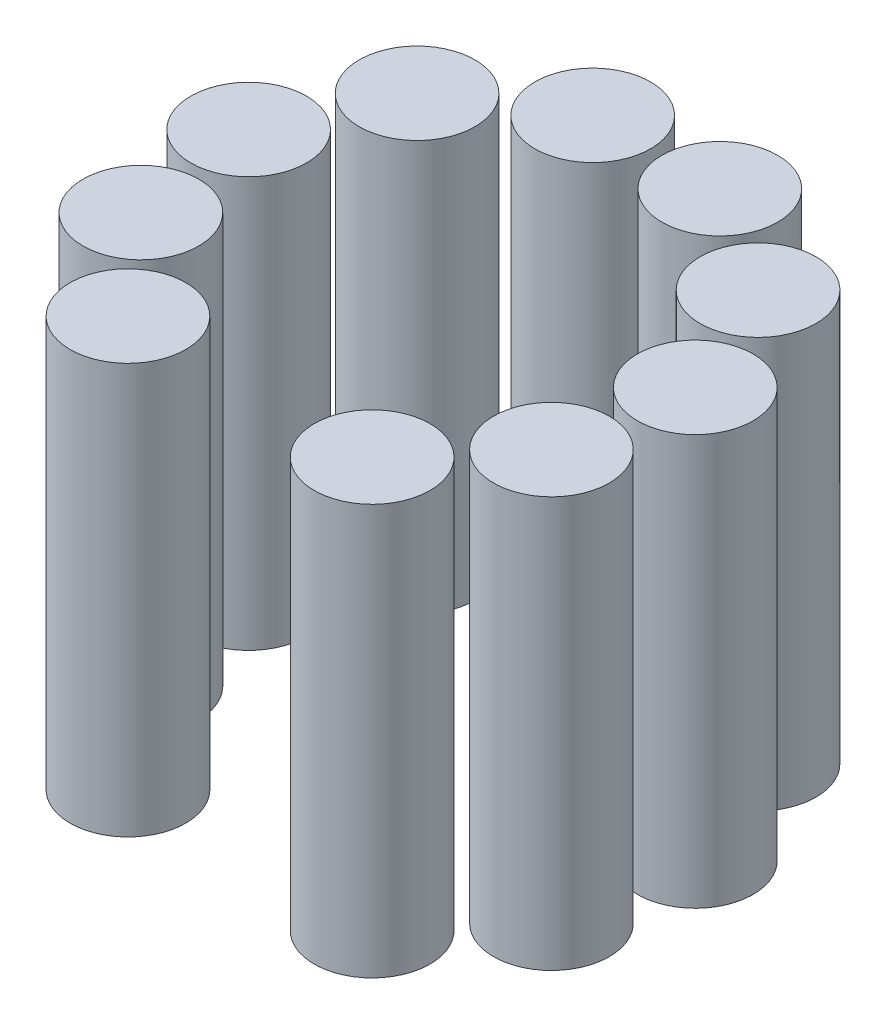
ISO-10303-21;
HEADER;
FILE_DESCRIPTION(('STEP AP214'),'2;1');
FILE_NAME('part.step','',(''),(''),'','','');
FILE_SCHEMA(('AUTOMOTIVE_DESIGN { 1 0 10303 214 1 1 1 1 }'));
ENDSEC;
DATA;
#1=APPLICATION_CONTEXT('core data for automotive mechanical design processes');
#2=APPLICATION_PROTOCOL_DEFINITION('international standard','automotive_design',2000,#1);
#3=PRODUCT_CONTEXT('',#1,'mechanical');
#4=PRODUCT('Part','Part','',(#3));
#5=PRODUCT_RELATED_PRODUCT_CATEGORY('part','',(#4));
#6=PRODUCT_DEFINITION_FORMATION('','',#4);
#7=PRODUCT_DEFINITION_CONTEXT('part definition',#1,'design');
#8=PRODUCT_DEFINITION('design','',#6,#7);
#9=PRODUCT_DEFINITION_SHAPE('','',#8);
#10=(LENGTH_UNIT() NAMED_UNIT(*) SI_UNIT(.MILLI.,.METRE.));
#11=(NAMED_UNIT(*) PLANE_ANGLE_UNIT() SI_UNIT($,.RADIAN.));
#12=(NAMED_UNIT(*) SI_UNIT($,.STERADIAN.) SOLID_ANGLE_UNIT());
#13=UNCERTAINTY_MEASURE_WITH_UNIT(LENGTH_MEASURE(1.E-05),#10,'distance_accuracy_value','');
#14=(GEOMETRIC_REPRESENTATION_CONTEXT(3) GLOBAL_UNCERTAINTY_ASSIGNED_CONTEXT((#13)) GLOBAL_UNIT_ASSIGNED_CONTEXT((#10,
#11,#12)) REPRESENTATION_CONTEXT('',''));
#15=CARTESIAN_POINT('',(0.,0.,0.));
#16=DIRECTION('',(0.,0.,1.));
#17=DIRECTION('',(1.,0.,0.));
#18=AXIS2_PLACEMENT_3D('',#15,#16,#17);
#19=CARTESIAN_POINT('',(10.0697618662976,65.,-34.3025129685284));
#20=DIRECTION('',(0.,-1.,0.));
#21=DIRECTION('',(0.,0.,-1.));
#22=AXIS2_PLACEMENT_3D('',#19,#20,#21);
#23=CYLINDRICAL_SURFACE('',#22,9.175);
#24=CARTESIAN_POINT('',(10.0697618662976,65.,-34.3025129685284));
#25=DIRECTION('',(0.,1.,0.));
#26=DIRECTION('',(0.,0.,-1.));
#27=AXIS2_PLACEMENT_3D('',#24,#25,#26);
#28=CIRCLE('',#27,9.175);
#29=CARTESIAN_POINT('',(10.0697618662976,65.,-43.4775129685284));
#30=VERTEX_POINT('',#29);
#31=EDGE_CURVE('E11',#30,#30,#28,.T.);
#32=ORIENTED_EDGE('',*,*,#31,.F.);
#33=EDGE_LOOP('',(#32));
#34=FACE_BOUND('',#33,.T.);
#35=CARTESIAN_POINT('',(10.0697618662976,0.,-34.3025129685284));
#36=DIRECTION('',(0.,1.,0.));
#37=DIRECTION('',(0.,0.,-1.));
#38=AXIS2_PLACEMENT_3D('',#35,#36,#37);
#39=CIRCLE('',#38,9.175);
#40=CARTESIAN_POINT('',(10.0697618662976,0.,-43.4775129685284));
#41=VERTEX_POINT('',#40);
#42=EDGE_CURVE('E48',#41,#41,#39,.T.);
#43=ORIENTED_EDGE('',*,*,#42,.T.);
#44=EDGE_LOOP('',(#43));
#45=FACE_BOUND('',#44,.T.);
#46=ADVANCED_FACE('F45',(#34,#45),#23,.T.);
#47=CARTESIAN_POINT('',(10.0697618662976,65.,-34.3025129685284));
#48=DIRECTION('',(0.,-1.,0.));
#49=DIRECTION('',(0.,0.,-1.));
#50=AXIS2_PLACEMENT_3D('',#47,#48,#49);
#51=PLANE('',#50);
#52=ORIENTED_EDGE('',*,*,#31,.T.);
#53=EDGE_LOOP('',(#52));
#54=FACE_BOUND('',#53,.T.);
#55=ADVANCED_FACE('F60',(#54),#51,.F.);
#56=CARTESIAN_POINT('',(10.0697618662976,0.,-34.3025129685284));
#57=DIRECTION('',(0.,-1.,0.));
#58=DIRECTION('',(0.,0.,-1.));
#59=AXIS2_PLACEMENT_3D('',#56,#57,#58);
#60=PLANE('',#59);
#61=ORIENTED_EDGE('',*,*,#42,.F.);
#62=EDGE_LOOP('',(#61));
#63=FACE_BOUND('',#62,.T.);
#64=ADVANCED_FACE('F58',(#63),#60,.T.);
#65=CLOSED_SHELL('',(#46,#55,#64));
#66=MANIFOLD_SOLID_BREP('B2',#65);
#67=CARTESIAN_POINT('',(27.0135892978425,65.,-23.4164150383335));
#68=DIRECTION('',(0.,-1.,0.));
#69=DIRECTION('',(0.,0.,-1.));
#70=AXIS2_PLACEMENT_3D('',#67,#68,#69);
#71=CYLINDRICAL_SURFACE('',#70,9.17500000000004);
#72=CARTESIAN_POINT('',(27.0135892978425,65.,-23.4164150383335));
#73=DIRECTION('',(0.,1.,0.));
#74=DIRECTION('',(0.,0.,-1.));
#75=AXIS2_PLACEMENT_3D('',#72,#73,#74);
#76=CIRCLE('',#75,9.17500000000004);
#77=CARTESIAN_POINT('',(27.0135892978425,65.,-32.5914150383335));
#78=VERTEX_POINT('',#77);
#79=EDGE_CURVE('E44',#78,#78,#76,.T.);
#80=ORIENTED_EDGE('',*,*,#79,.F.);
#81=EDGE_LOOP('',(#80));
#82=FACE_BOUND('',#81,.T.);
#83=CARTESIAN_POINT('',(27.0135892978425,0.,-23.4164150383335));
#84=DIRECTION('',(0.,1.,0.));
#85=DIRECTION('',(0.,0.,-1.));
#86=AXIS2_PLACEMENT_3D('',#83,#84,#85);
#87=CIRCLE('',#86,9.17500000000004);
#88=CARTESIAN_POINT('',(27.0135892978425,0.,-32.5914150383335));
#89=VERTEX_POINT('',#88);
#90=EDGE_CURVE('E102',#89,#89,#87,.T.);
#91=ORIENTED_EDGE('',*,*,#90,.T.);
#92=EDGE_LOOP('',(#91));
#93=FACE_BOUND('',#92,.T.);
#94=ADVANCED_FACE('F99',(#82,#93),#71,.T.);
#95=CARTESIAN_POINT('',(27.0135892978425,65.,-23.4164150383335));
#96=DIRECTION('',(0.,-1.,0.));
#97=DIRECTION('',(0.,0.,-1.));
#98=AXIS2_PLACEMENT_3D('',#95,#96,#97);
#99=PLANE('',#98);
#100=ORIENTED_EDGE('',*,*,#79,.T.);
#101=EDGE_LOOP('',(#100));
#102=FACE_BOUND('',#101,.T.);
#103=ADVANCED_FACE('F114',(#102),#99,.F.);
#104=CARTESIAN_POINT('',(27.0135892978425,0.,-23.4164150383335));
#105=DIRECTION('',(0.,-1.,0.));
#106=DIRECTION('',(0.,0.,-1.));
#107=AXIS2_PLACEMENT_3D('',#104,#105,#106);
#108=PLANE('',#107);
#109=ORIENTED_EDGE('',*,*,#90,.F.);
#110=EDGE_LOOP('',(#109));
#111=FACE_BOUND('',#110,.T.);
#112=ADVANCED_FACE('F112',(#111),#108,.T.);
#113=CLOSED_SHELL('',(#94,#103,#112));
#114=MANIFOLD_SOLID_BREP('B6',#113);
#115=CARTESIAN_POINT('',(35.3845002549535,65.,-5.09898437997192));
#116=DIRECTION('',(0.,-1.,0.));
#117=DIRECTION('',(0.,0.,-1.));
#118=AXIS2_PLACEMENT_3D('',#115,#116,#117);
#119=CYLINDRICAL_SURFACE('',#118,9.17500000000001);
#120=CARTESIAN_POINT('',(35.3845002549535,65.,-5.09898437997192));
#121=DIRECTION('',(0.,1.,0.));
#122=DIRECTION('',(0.,0.,-1.));
#123=AXIS2_PLACEMENT_3D('',#120,#121,#122);
#124=CIRCLE('',#123,9.17500000000001);
#125=CARTESIAN_POINT('',(35.3845002549535,65.,-14.2739843799719));
#126=VERTEX_POINT('',#125);
#127=EDGE_CURVE('E98',#126,#126,#124,.T.);
#128=ORIENTED_EDGE('',*,*,#127,.F.);
#129=EDGE_LOOP('',(#128));
#130=FACE_BOUND('',#129,.T.);
#131=CARTESIAN_POINT('',(35.3845002549535,0.,-5.09898437997192));
#132=DIRECTION('',(0.,1.,0.));
#133=DIRECTION('',(0.,0.,-1.));
#134=AXIS2_PLACEMENT_3D('',#131,#132,#133);
#135=CIRCLE('',#134,9.17500000000001);
#136=CARTESIAN_POINT('',(35.3845002549535,0.,-14.2739843799719));
#137=VERTEX_POINT('',#136);
#138=EDGE_CURVE('E156',#137,#137,#135,.T.);
#139=ORIENTED_EDGE('',*,*,#138,.T.);
#140=EDGE_LOOP('',(#139));
#141=FACE_BOUND('',#140,.T.);
#142=ADVANCED_FACE('F153',(#130,#141),#119,.T.);
#143=CARTESIAN_POINT('',(35.3845002549535,65.,-5.09898437997192));
#144=DIRECTION('',(0.,-1.,0.));
#145=DIRECTION('',(0.,0.,-1.));
#146=AXIS2_PLACEMENT_3D('',#143,#144,#145);
#147=PLANE('',#146);
#148=ORIENTED_EDGE('',*,*,#127,.T.);
#149=EDGE_LOOP('',(#148));
#150=FACE_BOUND('',#149,.T.);
#151=ADVANCED_FACE('F168',(#150),#147,.F.);
#152=CARTESIAN_POINT('',(35.3845002549535,0.,-5.09898437997192));
#153=DIRECTION('',(0.,-1.,0.));
#154=DIRECTION('',(0.,0.,-1.));
#155=AXIS2_PLACEMENT_3D('',#152,#153,#154);
#156=PLANE('',#155);
#157=ORIENTED_EDGE('',*,*,#138,.F.);
#158=EDGE_LOOP('',(#157));
#159=FACE_BOUND('',#158,.T.);
#160=ADVANCED_FACE('F166',(#159),#156,.T.);
#161=CLOSED_SHELL('',(#142,#151,#160));
#162=MANIFOLD_SOLID_BREP('B39',#161);
#163=CARTESIAN_POINT('',(32.5259384518664,65.,14.8366380229955));
#164=DIRECTION('',(0.,-1.,0.));
#165=DIRECTION('',(0.,0.,-1.));
#166=AXIS2_PLACEMENT_3D('',#163,#164,#165);
#167=CYLINDRICAL_SURFACE('',#166,9.17500000000001);
#168=CARTESIAN_POINT('',(32.5259384518664,65.,14.8366380229955));
#169=DIRECTION('',(0.,1.,0.));
#170=DIRECTION('',(0.,0.,-1.));
#171=AXIS2_PLACEMENT_3D('',#168,#169,#170);
#172=CIRCLE('',#171,9.17500000000001);
#173=CARTESIAN_POINT('',(32.5259384518664,65.,5.66163802299551));
#174=VERTEX_POINT('',#173);
#175=EDGE_CURVE('E152',#174,#174,#172,.T.);
#176=ORIENTED_EDGE('',*,*,#175,.F.);
#177=EDGE_LOOP('',(#176));
#178=FACE_BOUND('',#177,.T.);
#179=CARTESIAN_POINT('',(32.5259384518664,0.,14.8366380229955));
#180=DIRECTION('',(0.,1.,0.));
#181=DIRECTION('',(0.,0.,-1.));
#182=AXIS2_PLACEMENT_3D('',#179,#180,#181);
#183=CIRCLE('',#182,9.17500000000001);
#184=CARTESIAN_POINT('',(32.5259384518664,0.,5.66163802299551));
#185=VERTEX_POINT('',#184);
#186=EDGE_CURVE('E210',#185,#185,#183,.T.);
#187=ORIENTED_EDGE('',*,*,#186,.T.);
#188=EDGE_LOOP('',(#187));
#189=FACE_BOUND('',#188,.T.);
#190=ADVANCED_FACE('F207',(#178,#189),#167,.T.);
#191=CARTESIAN_POINT('',(32.5259384518664,65.,14.8366380229955));
#192=DIRECTION('',(0.,-1.,0.));
#193=DIRECTION('',(0.,0.,-1.));
#194=AXIS2_PLACEMENT_3D('',#191,#192,#193);
#195=PLANE('',#194);
#196=ORIENTED_EDGE('',*,*,#175,.T.);
#197=EDGE_LOOP('',(#196));
#198=FACE_BOUND('',#197,.T.);
#199=ADVANCED_FACE('F222',(#198),#195,.F.);
#200=CARTESIAN_POINT('',(32.5259384518664,0.,14.8366380229955));
#201=DIRECTION('',(0.,-1.,0.));
#202=DIRECTION('',(0.,0.,-1.));
#203=AXIS2_PLACEMENT_3D('',#200,#201,#202);
#204=PLANE('',#203);
#205=ORIENTED_EDGE('',*,*,#186,.F.);
#206=EDGE_LOOP('',(#205));
#207=FACE_BOUND('',#206,.T.);
#208=ADVANCED_FACE('F220',(#207),#204,.T.);
#209=CLOSED_SHELL('',(#190,#199,#208));
#210=MANIFOLD_SOLID_BREP('B93',#209);
#211=CARTESIAN_POINT('',(19.3450847635356,65.,30.0637688171597));
#212=DIRECTION('',(0.,-1.,0.));
#213=DIRECTION('',(0.,0.,-1.));
#214=AXIS2_PLACEMENT_3D('',#211,#212,#213);
#215=CYLINDRICAL_SURFACE('',#214,9.175);
#216=CARTESIAN_POINT('',(19.3450847635356,65.,30.0637688171597));
#217=DIRECTION('',(0.,1.,0.));
#218=DIRECTION('',(0.,0.,-1.));
#219=AXIS2_PLACEMENT_3D('',#216,#217,#218);
#220=CIRCLE('',#219,9.175);
#221=CARTESIAN_POINT('',(19.3450847635356,65.,20.8887688171597));
#222=VERTEX_POINT('',#221);
#223=EDGE_CURVE('E206',#222,#222,#220,.T.);
#224=ORIENTED_EDGE('',*,*,#223,.F.);
#225=EDGE_LOOP('',(#224));
#226=FACE_BOUND('',#225,.T.);
#227=CARTESIAN_POINT('',(19.3450847635356,0.,30.0637688171597));
#228=DIRECTION('',(0.,1.,0.));
#229=DIRECTION('',(0.,0.,-1.));
#230=AXIS2_PLACEMENT_3D('',#227,#228,#229);
#231=CIRCLE('',#230,9.175);
#232=CARTESIAN_POINT('',(19.3450847635356,0.,20.8887688171597));
#233=VERTEX_POINT('',#232);
#234=EDGE_CURVE('E264',#233,#233,#231,.T.);
#235=ORIENTED_EDGE('',*,*,#234,.T.);
#236=EDGE_LOOP('',(#235));
#237=FACE_BOUND('',#236,.T.);
#238=ADVANCED_FACE('F261',(#226,#237),#215,.T.);
#239=CARTESIAN_POINT('',(19.3450847635356,65.,30.0637688171597));
#240=DIRECTION('',(0.,-1.,0.));
#241=DIRECTION('',(0.,0.,-1.));
#242=AXIS2_PLACEMENT_3D('',#239,#240,#241);
#243=PLANE('',#242);
#244=ORIENTED_EDGE('',*,*,#223,.T.);
#245=EDGE_LOOP('',(#244));
#246=FACE_BOUND('',#245,.T.);
#247=ADVANCED_FACE('F276',(#246),#243,.F.);
#248=CARTESIAN_POINT('',(19.3450847635356,0.,30.0637688171597));
#249=DIRECTION('',(0.,-1.,0.));
#250=DIRECTION('',(0.,0.,-1.));
#251=AXIS2_PLACEMENT_3D('',#248,#249,#250);
#252=PLANE('',#251);
#253=ORIENTED_EDGE('',*,*,#234,.F.);
#254=EDGE_LOOP('',(#253));
#255=FACE_BOUND('',#254,.T.);
#256=ADVANCED_FACE('F274',(#255),#252,.T.);
#257=CLOSED_SHELL('',(#238,#247,#256));
#258=MANIFOLD_SOLID_BREP('B147',#257);
#259=CARTESIAN_POINT('',(-19.3450847635356,65.,30.0637688171597));
#260=DIRECTION('',(0.,-1.,0.));
#261=DIRECTION('',(0.,0.,-1.));
#262=AXIS2_PLACEMENT_3D('',#259,#260,#261);
#263=CYLINDRICAL_SURFACE('',#262,9.175);
#264=CARTESIAN_POINT('',(-19.3450847635356,65.,30.0637688171597));
#265=DIRECTION('',(0.,1.,0.));
#266=DIRECTION('',(0.,0.,1.));
#267=AXIS2_PLACEMENT_3D('',#264,#265,#266);
#268=CIRCLE('',#267,9.175);
#269=CARTESIAN_POINT('',(-19.3450847635356,65.,39.2387688171597));
#270=VERTEX_POINT('',#269);
#271=EDGE_CURVE('E260',#270,#270,#268,.T.);
#272=ORIENTED_EDGE('',*,*,#271,.F.);
#273=EDGE_LOOP('',(#272));
#274=FACE_BOUND('',#273,.T.);
#275=CARTESIAN_POINT('',(-19.3450847635356,0.,30.0637688171597));
#276=DIRECTION('',(0.,1.,0.));
#277=DIRECTION('',(0.,0.,1.));
#278=AXIS2_PLACEMENT_3D('',#275,#276,#277);
#279=CIRCLE('',#278,9.175);
#280=CARTESIAN_POINT('',(-19.3450847635356,0.,39.2387688171597));
#281=VERTEX_POINT('',#280);
#282=EDGE_CURVE('E318',#281,#281,#279,.T.);
#283=ORIENTED_EDGE('',*,*,#282,.T.);
#284=EDGE_LOOP('',(#283));
#285=FACE_BOUND('',#284,.T.);
#286=ADVANCED_FACE('F315',(#274,#285),#263,.T.);
#287=CARTESIAN_POINT('',(-19.3450847635356,65.,30.0637688171597));
#288=DIRECTION('',(0.,1.,0.));
#289=DIRECTION('',(0.,0.,1.));
#290=AXIS2_PLACEMENT_3D('',#287,#288,#289);
#291=PLANE('',#290);
#292=ORIENTED_EDGE('',*,*,#271,.T.);
#293=EDGE_LOOP('',(#292));
#294=FACE_BOUND('',#293,.T.);
#295=ADVANCED_FACE('F330',(#294),#291,.T.);
#296=CARTESIAN_POINT('',(-19.3450847635356,0.,30.0637688171597));
#297=DIRECTION('',(0.,1.,0.));
#298=DIRECTION('',(0.,0.,1.));
#299=AXIS2_PLACEMENT_3D('',#296,#297,#298);
#300=PLANE('',#299);
#301=ORIENTED_EDGE('',*,*,#282,.F.);
#302=EDGE_LOOP('',(#301));
#303=FACE_BOUND('',#302,.T.);
#304=ADVANCED_FACE('F328',(#303),#300,.F.);
#305=CLOSED_SHELL('',(#286,#295,#304));
#306=MANIFOLD_SOLID_BREP('B201',#305);
#307=CARTESIAN_POINT('',(-32.5259384518664,65.,14.8366380229955));
#308=DIRECTION('',(0.,-1.,0.));
#309=DIRECTION('',(0.,0.,-1.));
#310=AXIS2_PLACEMENT_3D('',#307,#308,#309);
#311=CYLINDRICAL_SURFACE('',#310,9.175);
#312=CARTESIAN_POINT('',(-32.5259384518664,65.,14.8366380229955));
#313=DIRECTION('',(0.,1.,0.));
#314=DIRECTION('',(0.,0.,1.));
#315=AXIS2_PLACEMENT_3D('',#312,#313,#314);
#316=CIRCLE('',#315,9.175);
#317=CARTESIAN_POINT('',(-32.5259384518664,65.,24.0116380229955));
#318=VERTEX_POINT('',#317);
#319=EDGE_CURVE('E314',#318,#318,#316,.T.);
#320=ORIENTED_EDGE('',*,*,#319,.F.);
#321=EDGE_LOOP('',(#320));
#322=FACE_BOUND('',#321,.T.);
#323=CARTESIAN_POINT('',(-32.5259384518664,0.,14.8366380229955));
#324=DIRECTION('',(0.,1.,0.));
#325=DIRECTION('',(0.,0.,1.));
#326=AXIS2_PLACEMENT_3D('',#323,#324,#325);
#327=CIRCLE('',#326,9.175);
#328=CARTESIAN_POINT('',(-32.5259384518664,0.,24.0116380229955));
#329=VERTEX_POINT('',#328);
#330=EDGE_CURVE('E372',#329,#329,#327,.T.);
#331=ORIENTED_EDGE('',*,*,#330,.T.);
#332=EDGE_LOOP('',(#331));
#333=FACE_BOUND('',#332,.T.);
#334=ADVANCED_FACE('F369',(#322,#333),#311,.T.);
#335=CARTESIAN_POINT('',(-32.5259384518664,65.,14.8366380229955));
#336=DIRECTION('',(0.,1.,0.));
#337=DIRECTION('',(0.,0.,1.));
#338=AXIS2_PLACEMENT_3D('',#335,#336,#337);
#339=PLANE('',#338);
#340=ORIENTED_EDGE('',*,*,#319,.T.);
#341=EDGE_LOOP('',(#340));
#342=FACE_BOUND('',#341,.T.);
#343=ADVANCED_FACE('F384',(#342),#339,.T.);
#344=CARTESIAN_POINT('',(-32.5259384518664,0.,14.8366380229955));
#345=DIRECTION('',(0.,1.,0.));
#346=DIRECTION('',(0.,0.,1.));
#347=AXIS2_PLACEMENT_3D('',#344,#345,#346);
#348=PLANE('',#347);
#349=ORIENTED_EDGE('',*,*,#330,.F.);
#350=EDGE_LOOP('',(#349));
#351=FACE_BOUND('',#350,.T.);
#352=ADVANCED_FACE('F382',(#351),#348,.F.);
#353=CLOSED_SHELL('',(#334,#343,#352));
#354=MANIFOLD_SOLID_BREP('B255',#353);
#355=CARTESIAN_POINT('',(-35.3845002549535,65.,-5.09898437997192));
#356=DIRECTION('',(0.,-1.,0.));
#357=DIRECTION('',(0.,0.,-1.));
#358=AXIS2_PLACEMENT_3D('',#355,#356,#357);
#359=CYLINDRICAL_SURFACE('',#358,9.17500000000001);
#360=CARTESIAN_POINT('',(-35.3845002549535,65.,-5.09898437997192));
#361=DIRECTION('',(0.,1.,0.));
#362=DIRECTION('',(0.,0.,1.));
#363=AXIS2_PLACEMENT_3D('',#360,#361,#362);
#364=CIRCLE('',#363,9.17500000000001);
#365=CARTESIAN_POINT('',(-35.3845002549535,65.,4.07601562002808));
#366=VERTEX_POINT('',#365);
#367=EDGE_CURVE('E368',#366,#366,#364,.T.);
#368=ORIENTED_EDGE('',*,*,#367,.F.);
#369=EDGE_LOOP('',(#368));
#370=FACE_BOUND('',#369,.T.);
#371=CARTESIAN_POINT('',(-35.3845002549535,0.,-5.09898437997192));
#372=DIRECTION('',(0.,1.,0.));
#373=DIRECTION('',(0.,0.,1.));
#374=AXIS2_PLACEMENT_3D('',#371,#372,#373);
#375=CIRCLE('',#374,9.17500000000001);
#376=CARTESIAN_POINT('',(-35.3845002549535,0.,4.07601562002808));
#377=VERTEX_POINT('',#376);
#378=EDGE_CURVE('E426',#377,#377,#375,.T.);
#379=ORIENTED_EDGE('',*,*,#378,.T.);
#380=EDGE_LOOP('',(#379));
#381=FACE_BOUND('',#380,.T.);
#382=ADVANCED_FACE('F423',(#370,#381),#359,.T.);
#383=CARTESIAN_POINT('',(-35.3845002549535,65.,-5.09898437997192));
#384=DIRECTION('',(0.,1.,0.));
#385=DIRECTION('',(0.,0.,1.));
#386=AXIS2_PLACEMENT_3D('',#383,#384,#385);
#387=PLANE('',#386);
#388=ORIENTED_EDGE('',*,*,#367,.T.);
#389=EDGE_LOOP('',(#388));
#390=FACE_BOUND('',#389,.T.);
#391=ADVANCED_FACE('F438',(#390),#387,.T.);
#392=CARTESIAN_POINT('',(-35.3845002549535,0.,-5.09898437997192));
#393=DIRECTION('',(0.,1.,0.));
#394=DIRECTION('',(0.,0.,1.));
#395=AXIS2_PLACEMENT_3D('',#392,#393,#394);
#396=PLANE('',#395);
#397=ORIENTED_EDGE('',*,*,#378,.F.);
#398=EDGE_LOOP('',(#397));
#399=FACE_BOUND('',#398,.T.);
#400=ADVANCED_FACE('F436',(#399),#396,.F.);
#401=CLOSED_SHELL('',(#382,#391,#400));
#402=MANIFOLD_SOLID_BREP('B309',#401);
#403=CARTESIAN_POINT('',(-27.0135892978425,65.,-23.4164150383335));
#404=DIRECTION('',(0.,-1.,0.));
#405=DIRECTION('',(0.,0.,-1.));
#406=AXIS2_PLACEMENT_3D('',#403,#404,#405);
#407=CYLINDRICAL_SURFACE('',#406,9.17500000000005);
#408=CARTESIAN_POINT('',(-27.0135892978425,65.,-23.4164150383335));
#409=DIRECTION('',(0.,1.,0.));
#410=DIRECTION('',(0.,0.,1.));
#411=AXIS2_PLACEMENT_3D('',#408,#409,#410);
#412=CIRCLE('',#411,9.17500000000005);
#413=CARTESIAN_POINT('',(-27.0135892978425,65.,-14.2414150383334));
#414=VERTEX_POINT('',#413);
#415=EDGE_CURVE('E422',#414,#414,#412,.T.);
#416=ORIENTED_EDGE('',*,*,#415,.F.);
#417=EDGE_LOOP('',(#416));
#418=FACE_BOUND('',#417,.T.);
#419=CARTESIAN_POINT('',(-27.0135892978425,0.,-23.4164150383335));
#420=DIRECTION('',(0.,1.,0.));
#421=DIRECTION('',(0.,0.,1.));
#422=AXIS2_PLACEMENT_3D('',#419,#420,#421);
#423=CIRCLE('',#422,9.17500000000005);
#424=CARTESIAN_POINT('',(-27.0135892978425,0.,-14.2414150383334));
#425=VERTEX_POINT('',#424);
#426=EDGE_CURVE('E479',#425,#425,#423,.T.);
#427=ORIENTED_EDGE('',*,*,#426,.T.);
#428=EDGE_LOOP('',(#427));
#429=FACE_BOUND('',#428,.T.);
#430=ADVANCED_FACE('F476',(#418,#429),#407,.T.);
#431=CARTESIAN_POINT('',(-27.0135892978425,65.,-23.4164150383335));
#432=DIRECTION('',(0.,1.,0.));
#433=DIRECTION('',(0.,0.,1.));
#434=AXIS2_PLACEMENT_3D('',#431,#432,#433);
#435=PLANE('',#434);
#436=ORIENTED_EDGE('',*,*,#415,.T.);
#437=EDGE_LOOP('',(#436));
#438=FACE_BOUND('',#437,.T.);
#439=ADVANCED_FACE('F491',(#438),#435,.T.);
#440=CARTESIAN_POINT('',(-27.0135892978425,0.,-23.4164150383335));
#441=DIRECTION('',(0.,1.,0.));
#442=DIRECTION('',(0.,0.,1.));
#443=AXIS2_PLACEMENT_3D('',#440,#441,#442);
#444=PLANE('',#443);
#445=ORIENTED_EDGE('',*,*,#426,.F.);
#446=EDGE_LOOP('',(#445));
#447=FACE_BOUND('',#446,.T.);
#448=ADVANCED_FACE('F489',(#447),#444,.F.);
#449=CLOSED_SHELL('',(#430,#439,#448));
#450=MANIFOLD_SOLID_BREP('B363',#449);
#451=CARTESIAN_POINT('',(-10.0697618662976,65.,-34.3025129685284));
#452=DIRECTION('',(0.,-1.,0.));
#453=DIRECTION('',(0.,0.,-1.));
#454=AXIS2_PLACEMENT_3D('',#451,#452,#453);
#455=CYLINDRICAL_SURFACE('',#454,9.175);
#456=CARTESIAN_POINT('',(-10.0697618662976,65.,-34.3025129685284));
#457=DIRECTION('',(0.,1.,0.));
#458=DIRECTION('',(0.,0.,1.));
#459=AXIS2_PLACEMENT_3D('',#456,#457,#458);
#460=CIRCLE('',#459,9.175);
#461=CARTESIAN_POINT('',(-10.0697618662976,65.,-25.1275129685284));
#462=VERTEX_POINT('',#461);
#463=EDGE_CURVE('E475',#462,#462,#460,.T.);
#464=ORIENTED_EDGE('',*,*,#463,.F.);
#465=EDGE_LOOP('',(#464));
#466=FACE_BOUND('',#465,.T.);
#467=CARTESIAN_POINT('',(-10.0697618662976,0.,-34.3025129685284));
#468=DIRECTION('',(0.,1.,0.));
#469=DIRECTION('',(0.,0.,1.));
#470=AXIS2_PLACEMENT_3D('',#467,#468,#469);
#471=CIRCLE('',#470,9.175);
#472=CARTESIAN_POINT('',(-10.0697618662976,0.,-25.1275129685284));
#473=VERTEX_POINT('',#472);
#474=EDGE_CURVE('E525',#473,#473,#471,.T.);
#475=ORIENTED_EDGE('',*,*,#474,.T.);
#476=EDGE_LOOP('',(#475));
#477=FACE_BOUND('',#476,.T.);
#478=ADVANCED_FACE('F522',(#466,#477),#455,.T.);
#479=CARTESIAN_POINT('',(-10.0697618662976,65.,-34.3025129685284));
#480=DIRECTION('',(0.,1.,0.));
#481=DIRECTION('',(0.,0.,1.));
#482=AXIS2_PLACEMENT_3D('',#479,#480,#481);
#483=PLANE('',#482);
#484=ORIENTED_EDGE('',*,*,#463,.T.);
#485=EDGE_LOOP('',(#484));
#486=FACE_BOUND('',#485,.T.);
#487=ADVANCED_FACE('F537',(#486),#483,.T.);
#488=CARTESIAN_POINT('',(-10.0697618662976,0.,-34.3025129685284));
#489=DIRECTION('',(0.,1.,0.));
#490=DIRECTION('',(0.,0.,1.));
#491=AXIS2_PLACEMENT_3D('',#488,#489,#490);
#492=PLANE('',#491);
#493=ORIENTED_EDGE('',*,*,#474,.F.);
#494=EDGE_LOOP('',(#493));
#495=FACE_BOUND('',#494,.T.);
#496=ADVANCED_FACE('F535',(#495),#492,.F.);
#497=CLOSED_SHELL('',(#478,#487,#496));
#498=MANIFOLD_SOLID_BREP('B417',#497);
#499=ADVANCED_BREP_SHAPE_REPRESENTATION('',(#18,#66,#114,#162,#210,#258,#306,#354,#402,#450,
#498),#14);
#500=SHAPE_DEFINITION_REPRESENTATION(#9,#499);
ENDSEC;
END-ISO-10303-21;
